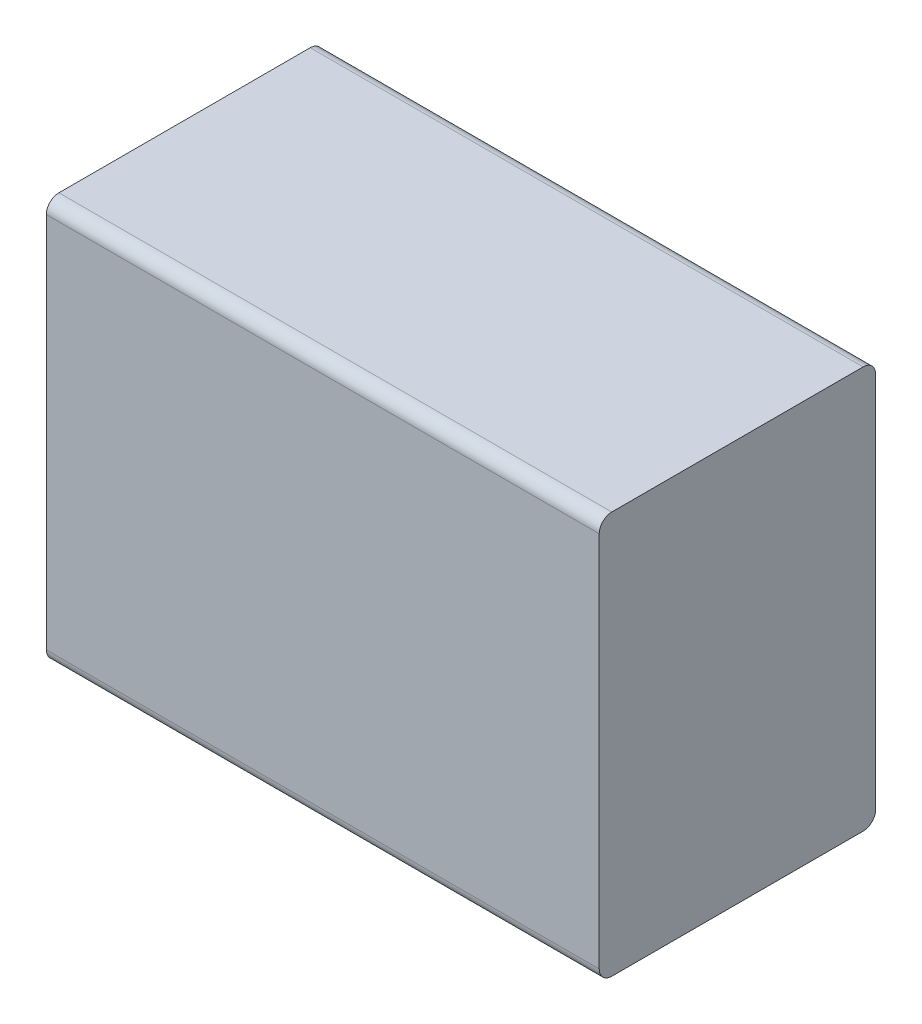
ISO-10303-21;
HEADER;
FILE_DESCRIPTION(('STEP AP214'),'2;1');
FILE_NAME('part.step','',(''),(''),'','','');
FILE_SCHEMA(('AUTOMOTIVE_DESIGN { 1 0 10303 214 1 1 1 1 }'));
ENDSEC;
DATA;
#1=APPLICATION_CONTEXT('core data for automotive mechanical design processes');
#2=APPLICATION_PROTOCOL_DEFINITION('international standard','automotive_design',2000,#1);
#3=PRODUCT_CONTEXT('',#1,'mechanical');
#4=PRODUCT('Part','Part','',(#3));
#5=PRODUCT_RELATED_PRODUCT_CATEGORY('part','',(#4));
#6=PRODUCT_DEFINITION_FORMATION('','',#4);
#7=PRODUCT_DEFINITION_CONTEXT('part definition',#1,'design');
#8=PRODUCT_DEFINITION('design','',#6,#7);
#9=PRODUCT_DEFINITION_SHAPE('','',#8);
#10=(LENGTH_UNIT() NAMED_UNIT(*) SI_UNIT(.MILLI.,.METRE.));
#11=(NAMED_UNIT(*) PLANE_ANGLE_UNIT() SI_UNIT($,.RADIAN.));
#12=(NAMED_UNIT(*) SI_UNIT($,.STERADIAN.) SOLID_ANGLE_UNIT());
#13=UNCERTAINTY_MEASURE_WITH_UNIT(LENGTH_MEASURE(1.E-05),#10,'distance_accuracy_value','');
#14=(GEOMETRIC_REPRESENTATION_CONTEXT(3) GLOBAL_UNCERTAINTY_ASSIGNED_CONTEXT((#13)) GLOBAL_UNIT_ASSIGNED_CONTEXT((#10,
#11,#12)) REPRESENTATION_CONTEXT('',''));
#15=CARTESIAN_POINT('',(0.,0.,0.));
#16=DIRECTION('',(0.,0.,1.));
#17=DIRECTION('',(1.,0.,0.));
#18=AXIS2_PLACEMENT_3D('',#15,#16,#17);
#19=CARTESIAN_POINT('',(0.,0.,1.1));
#20=DIRECTION('',(0.,0.,1.));
#21=DIRECTION('',(1.,0.,0.));
#22=AXIS2_PLACEMENT_3D('',#19,#20,#21);
#23=PLANE('',#22);
#24=DIRECTION('',(0.,1.,0.));
#25=VECTOR('',#24,1.);
#26=CARTESIAN_POINT('',(2.7,0.,1.1));
#27=LINE('',#26,#25);
#28=CARTESIAN_POINT('',(2.7,0.05,1.1));
#29=VERTEX_POINT('',#28);
#30=CARTESIAN_POINT('',(2.7,1.55,1.1));
#31=VERTEX_POINT('',#30);
#32=EDGE_CURVE('E80',#29,#31,#27,.T.);
#33=ORIENTED_EDGE('',*,*,#32,.T.);
#34=DIRECTION('',(1.,0.,0.));
#35=VECTOR('',#34,1.);
#36=CARTESIAN_POINT('',(0.,1.55,1.1));
#37=LINE('',#36,#35);
#38=CARTESIAN_POINT('',(0.5,1.55,1.1));
#39=VERTEX_POINT('',#38);
#40=EDGE_CURVE('E101',#39,#31,#37,.T.);
#41=ORIENTED_EDGE('',*,*,#40,.F.);
#42=DIRECTION('',(0.,1.,0.));
#43=VECTOR('',#42,1.);
#44=CARTESIAN_POINT('',(0.5,0.,1.1));
#45=LINE('',#44,#43);
#46=CARTESIAN_POINT('',(0.5,0.05,1.1));
#47=VERTEX_POINT('',#46);
#48=EDGE_CURVE('E109',#39,#47,#45,.F.);
#49=ORIENTED_EDGE('',*,*,#48,.T.);
#50=DIRECTION('',(1.,0.,0.));
#51=VECTOR('',#50,1.);
#52=CARTESIAN_POINT('',(0.,0.05,1.1));
#53=LINE('',#52,#51);
#54=EDGE_CURVE('E85',#29,#47,#53,.F.);
#55=ORIENTED_EDGE('',*,*,#54,.F.);
#56=EDGE_LOOP('',(#33,#41,#49,#55));
#57=FACE_BOUND('',#56,.T.);
#58=ADVANCED_FACE('F17',(#57),#23,.T.);
#59=CARTESIAN_POINT('',(0.,0.05,1.05));
#60=DIRECTION('',(1.,0.,0.));
#61=DIRECTION('',(0.,0.,-1.));
#62=AXIS2_PLACEMENT_3D('',#59,#60,#61);
#63=CYLINDRICAL_SURFACE('',#62,0.05);
#64=ORIENTED_EDGE('',*,*,#54,.T.);
#65=CARTESIAN_POINT('',(0.5,0.05,1.05));
#66=DIRECTION('',(1.,0.,0.));
#67=DIRECTION('',(0.,0.,-1.));
#68=AXIS2_PLACEMENT_3D('',#65,#66,#67);
#69=CIRCLE('',#68,0.05);
#70=CARTESIAN_POINT('',(0.5,0.,1.05));
#71=VERTEX_POINT('',#70);
#72=EDGE_CURVE('E98',#47,#71,#69,.T.);
#73=ORIENTED_EDGE('',*,*,#72,.T.);
#74=DIRECTION('',(1.,0.,0.));
#75=VECTOR('',#74,1.);
#76=CARTESIAN_POINT('',(0.,0.,1.05));
#77=LINE('',#76,#75);
#78=CARTESIAN_POINT('',(2.7,0.,1.05));
#79=VERTEX_POINT('',#78);
#80=EDGE_CURVE('E90',#71,#79,#77,.T.);
#81=ORIENTED_EDGE('',*,*,#80,.T.);
#82=CARTESIAN_POINT('',(2.7,0.05,1.05));
#83=DIRECTION('',(1.,0.,0.));
#84=DIRECTION('',(0.,0.,-1.));
#85=AXIS2_PLACEMENT_3D('',#82,#83,#84);
#86=CIRCLE('',#85,0.05);
#87=EDGE_CURVE('E20',#79,#29,#86,.F.);
#88=ORIENTED_EDGE('',*,*,#87,.T.);
#89=EDGE_LOOP('',(#64,#73,#81,#88));
#90=FACE_BOUND('',#89,.T.);
#91=ADVANCED_FACE('F96',(#90),#63,.T.);
#92=CARTESIAN_POINT('',(0.,1.55,1.05));
#93=DIRECTION('',(1.,0.,0.));
#94=DIRECTION('',(0.,0.,-1.));
#95=AXIS2_PLACEMENT_3D('',#92,#93,#94);
#96=CYLINDRICAL_SURFACE('',#95,0.05);
#97=ORIENTED_EDGE('',*,*,#40,.T.);
#98=CARTESIAN_POINT('',(2.7,1.55,1.05));
#99=DIRECTION('',(1.,0.,0.));
#100=DIRECTION('',(0.,0.,-1.));
#101=AXIS2_PLACEMENT_3D('',#98,#99,#100);
#102=CIRCLE('',#101,0.05);
#103=CARTESIAN_POINT('',(2.7,1.6,1.05));
#104=VERTEX_POINT('',#103);
#105=EDGE_CURVE('E99',#31,#104,#102,.F.);
#106=ORIENTED_EDGE('',*,*,#105,.T.);
#107=DIRECTION('',(1.,0.,0.));
#108=VECTOR('',#107,1.);
#109=CARTESIAN_POINT('',(0.,1.6,1.05));
#110=LINE('',#109,#108);
#111=CARTESIAN_POINT('',(0.5,1.6,1.05));
#112=VERTEX_POINT('',#111);
#113=EDGE_CURVE('E94',#112,#104,#110,.T.);
#114=ORIENTED_EDGE('',*,*,#113,.F.);
#115=CARTESIAN_POINT('',(0.5,1.55,1.05));
#116=DIRECTION('',(1.,0.,0.));
#117=DIRECTION('',(0.,0.,-1.));
#118=AXIS2_PLACEMENT_3D('',#115,#116,#117);
#119=CIRCLE('',#118,0.05);
#120=EDGE_CURVE('E107',#112,#39,#119,.T.);
#121=ORIENTED_EDGE('',*,*,#120,.T.);
#122=EDGE_LOOP('',(#97,#106,#114,#121));
#123=FACE_BOUND('',#122,.T.);
#124=ADVANCED_FACE('F126',(#123),#96,.T.);
#125=CARTESIAN_POINT('',(0.,0.,0.));
#126=DIRECTION('',(0.,1.,0.));
#127=DIRECTION('',(0.,0.,1.));
#128=AXIS2_PLACEMENT_3D('',#125,#126,#127);
#129=PLANE('',#128);
#130=ORIENTED_EDGE('',*,*,#80,.F.);
#131=DIRECTION('',(0.,0.,-1.));
#132=VECTOR('',#131,1.);
#133=CARTESIAN_POINT('',(0.5,0.,0.));
#134=LINE('',#133,#132);
#135=CARTESIAN_POINT('',(0.5,0.,0.05));
#136=VERTEX_POINT('',#135);
#137=EDGE_CURVE('E232',#71,#136,#134,.T.);
#138=ORIENTED_EDGE('',*,*,#137,.T.);
#139=DIRECTION('',(1.,0.,0.));
#140=VECTOR('',#139,1.);
#141=CARTESIAN_POINT('',(0.,0.,0.05));
#142=LINE('',#141,#140);
#143=CARTESIAN_POINT('',(2.7,0.,0.05));
#144=VERTEX_POINT('',#143);
#145=EDGE_CURVE('E92',#144,#136,#142,.F.);
#146=ORIENTED_EDGE('',*,*,#145,.F.);
#147=DIRECTION('',(0.,0.,1.));
#148=VECTOR('',#147,1.);
#149=CARTESIAN_POINT('',(2.7,0.,0.));
#150=LINE('',#149,#148);
#151=EDGE_CURVE('E77',#79,#144,#150,.F.);
#152=ORIENTED_EDGE('',*,*,#151,.F.);
#153=EDGE_LOOP('',(#130,#138,#146,#152));
#154=FACE_BOUND('',#153,.T.);
#155=ADVANCED_FACE('F88',(#154),#129,.F.);
#156=CARTESIAN_POINT('',(0.,1.6,0.));
#157=DIRECTION('',(0.,1.,0.));
#158=DIRECTION('',(0.,0.,1.));
#159=AXIS2_PLACEMENT_3D('',#156,#157,#158);
#160=PLANE('',#159);
#161=ORIENTED_EDGE('',*,*,#113,.T.);
#162=DIRECTION('',(0.,0.,-1.));
#163=VECTOR('',#162,1.);
#164=CARTESIAN_POINT('',(2.7,1.6,0.));
#165=LINE('',#164,#163);
#166=CARTESIAN_POINT('',(2.7,1.6,0.05));
#167=VERTEX_POINT('',#166);
#168=EDGE_CURVE('E120',#167,#104,#165,.F.);
#169=ORIENTED_EDGE('',*,*,#168,.F.);
#170=DIRECTION('',(1.,0.,0.));
#171=VECTOR('',#170,1.);
#172=CARTESIAN_POINT('',(0.,1.6,0.05));
#173=LINE('',#172,#171);
#174=CARTESIAN_POINT('',(0.5,1.6,0.05));
#175=VERTEX_POINT('',#174);
#176=EDGE_CURVE('E117',#175,#167,#173,.T.);
#177=ORIENTED_EDGE('',*,*,#176,.F.);
#178=DIRECTION('',(0.,0.,-1.));
#179=VECTOR('',#178,1.);
#180=CARTESIAN_POINT('',(0.5,1.6,0.));
#181=LINE('',#180,#179);
#182=EDGE_CURVE('E231',#175,#112,#181,.F.);
#183=ORIENTED_EDGE('',*,*,#182,.T.);
#184=EDGE_LOOP('',(#161,#169,#177,#183));
#185=FACE_BOUND('',#184,.T.);
#186=ADVANCED_FACE('F158',(#185),#160,.T.);
#187=CARTESIAN_POINT('',(0.5,0.,0.));
#188=DIRECTION('',(1.,0.,0.));
#189=DIRECTION('',(0.,0.,-1.));
#190=AXIS2_PLACEMENT_3D('',#187,#188,#189);
#191=PLANE('',#190);
#192=ORIENTED_EDGE('',*,*,#48,.F.);
#193=ORIENTED_EDGE('',*,*,#120,.F.);
#194=ORIENTED_EDGE('',*,*,#182,.F.);
#195=CARTESIAN_POINT('',(0.5,1.55,0.05));
#196=DIRECTION('',(1.,0.,0.));
#197=DIRECTION('',(0.,0.,-1.));
#198=AXIS2_PLACEMENT_3D('',#195,#196,#197);
#199=CIRCLE('',#198,0.05);
#200=CARTESIAN_POINT('',(0.5,1.55,0.));
#201=VERTEX_POINT('',#200);
#202=EDGE_CURVE('E112',#201,#175,#199,.T.);
#203=ORIENTED_EDGE('',*,*,#202,.F.);
#204=DIRECTION('',(0.,1.,0.));
#205=VECTOR('',#204,1.);
#206=CARTESIAN_POINT('',(0.5,0.,0.));
#207=LINE('',#206,#205);
#208=CARTESIAN_POINT('',(0.5,0.05,0.));
#209=VERTEX_POINT('',#208);
#210=EDGE_CURVE('E115',#201,#209,#207,.F.);
#211=ORIENTED_EDGE('',*,*,#210,.T.);
#212=CARTESIAN_POINT('',(0.5,0.05,0.05));
#213=DIRECTION('',(1.,0.,0.));
#214=DIRECTION('',(0.,0.,-1.));
#215=AXIS2_PLACEMENT_3D('',#212,#213,#214);
#216=CIRCLE('',#215,0.05);
#217=EDGE_CURVE('E121',#136,#209,#216,.T.);
#218=ORIENTED_EDGE('',*,*,#217,.F.);
#219=ORIENTED_EDGE('',*,*,#137,.F.);
#220=ORIENTED_EDGE('',*,*,#72,.F.);
#221=EDGE_LOOP('',(#192,#193,#194,#203,#211,#218,#219,#220));
#222=FACE_BOUND('',#221,.T.);
#223=ADVANCED_FACE('F132',(#222),#191,.F.);
#224=CARTESIAN_POINT('',(0.,0.05,0.05));
#225=DIRECTION('',(1.,0.,0.));
#226=DIRECTION('',(0.,0.,-1.));
#227=AXIS2_PLACEMENT_3D('',#224,#225,#226);
#228=CYLINDRICAL_SURFACE('',#227,0.05);
#229=DIRECTION('',(1.,0.,0.));
#230=VECTOR('',#229,1.);
#231=CARTESIAN_POINT('',(0.,0.05,0.));
#232=LINE('',#231,#230);
#233=CARTESIAN_POINT('',(2.7,0.05,0.));
#234=VERTEX_POINT('',#233);
#235=EDGE_CURVE('E238',#209,#234,#232,.T.);
#236=ORIENTED_EDGE('',*,*,#235,.T.);
#237=CARTESIAN_POINT('',(2.7,0.05,0.05));
#238=DIRECTION('',(1.,0.,0.));
#239=DIRECTION('',(0.,0.,-1.));
#240=AXIS2_PLACEMENT_3D('',#237,#238,#239);
#241=CIRCLE('',#240,0.05);
#242=EDGE_CURVE('E118',#144,#234,#241,.T.);
#243=ORIENTED_EDGE('',*,*,#242,.F.);
#244=ORIENTED_EDGE('',*,*,#145,.T.);
#245=ORIENTED_EDGE('',*,*,#217,.T.);
#246=EDGE_LOOP('',(#236,#243,#244,#245));
#247=FACE_BOUND('',#246,.T.);
#248=ADVANCED_FACE('F152',(#247),#228,.T.);
#249=CARTESIAN_POINT('',(2.7,0.,0.));
#250=DIRECTION('',(1.,0.,0.));
#251=DIRECTION('',(0.,0.,-1.));
#252=AXIS2_PLACEMENT_3D('',#249,#250,#251);
#253=PLANE('',#252);
#254=ORIENTED_EDGE('',*,*,#32,.F.);
#255=ORIENTED_EDGE('',*,*,#87,.F.);
#256=ORIENTED_EDGE('',*,*,#151,.T.);
#257=ORIENTED_EDGE('',*,*,#242,.T.);
#258=DIRECTION('',(0.,1.,0.));
#259=VECTOR('',#258,1.);
#260=CARTESIAN_POINT('',(2.7,0.,0.));
#261=LINE('',#260,#259);
#262=CARTESIAN_POINT('',(2.7,1.55,0.));
#263=VERTEX_POINT('',#262);
#264=EDGE_CURVE('E26',#234,#263,#261,.T.);
#265=ORIENTED_EDGE('',*,*,#264,.T.);
#266=CARTESIAN_POINT('',(2.7,1.55,0.05));
#267=DIRECTION('',(1.,0.,0.));
#268=DIRECTION('',(0.,0.,-1.));
#269=AXIS2_PLACEMENT_3D('',#266,#267,#268);
#270=CIRCLE('',#269,0.05);
#271=EDGE_CURVE('E34',#167,#263,#270,.F.);
#272=ORIENTED_EDGE('',*,*,#271,.F.);
#273=ORIENTED_EDGE('',*,*,#168,.T.);
#274=ORIENTED_EDGE('',*,*,#105,.F.);
#275=EDGE_LOOP('',(#254,#255,#256,#257,#265,#272,#273,#274));
#276=FACE_BOUND('',#275,.T.);
#277=ADVANCED_FACE('F76',(#276),#253,.T.);
#278=CARTESIAN_POINT('',(0.,1.55,0.05));
#279=DIRECTION('',(1.,0.,0.));
#280=DIRECTION('',(0.,0.,-1.));
#281=AXIS2_PLACEMENT_3D('',#278,#279,#280);
#282=CYLINDRICAL_SURFACE('',#281,0.05);
#283=DIRECTION('',(1.,0.,0.));
#284=VECTOR('',#283,1.);
#285=CARTESIAN_POINT('',(0.,1.55,0.));
#286=LINE('',#285,#284);
#287=EDGE_CURVE('E11',#263,#201,#286,.F.);
#288=ORIENTED_EDGE('',*,*,#287,.T.);
#289=ORIENTED_EDGE('',*,*,#202,.T.);
#290=ORIENTED_EDGE('',*,*,#176,.T.);
#291=ORIENTED_EDGE('',*,*,#271,.T.);
#292=EDGE_LOOP('',(#288,#289,#290,#291));
#293=FACE_BOUND('',#292,.T.);
#294=ADVANCED_FACE('F141',(#293),#282,.T.);
#295=CARTESIAN_POINT('',(0.,0.,0.));
#296=DIRECTION('',(0.,0.,1.));
#297=DIRECTION('',(1.,0.,0.));
#298=AXIS2_PLACEMENT_3D('',#295,#296,#297);
#299=PLANE('',#298);
#300=ORIENTED_EDGE('',*,*,#264,.F.);
#301=ORIENTED_EDGE('',*,*,#235,.F.);
#302=ORIENTED_EDGE('',*,*,#210,.F.);
#303=ORIENTED_EDGE('',*,*,#287,.F.);
#304=EDGE_LOOP('',(#300,#301,#302,#303));
#305=FACE_BOUND('',#304,.T.);
#306=ADVANCED_FACE('F139',(#305),#299,.F.);
#307=CLOSED_SHELL('',(#58,#91,#124,#155,#186,#223,#248,#277,#294,#306));
#308=MANIFOLD_SOLID_BREP('B1',#307);
#309=ADVANCED_BREP_SHAPE_REPRESENTATION('',(#18,#308),#14);
#310=SHAPE_DEFINITION_REPRESENTATION(#9,#309);
ENDSEC;
END-ISO-10303-21;
